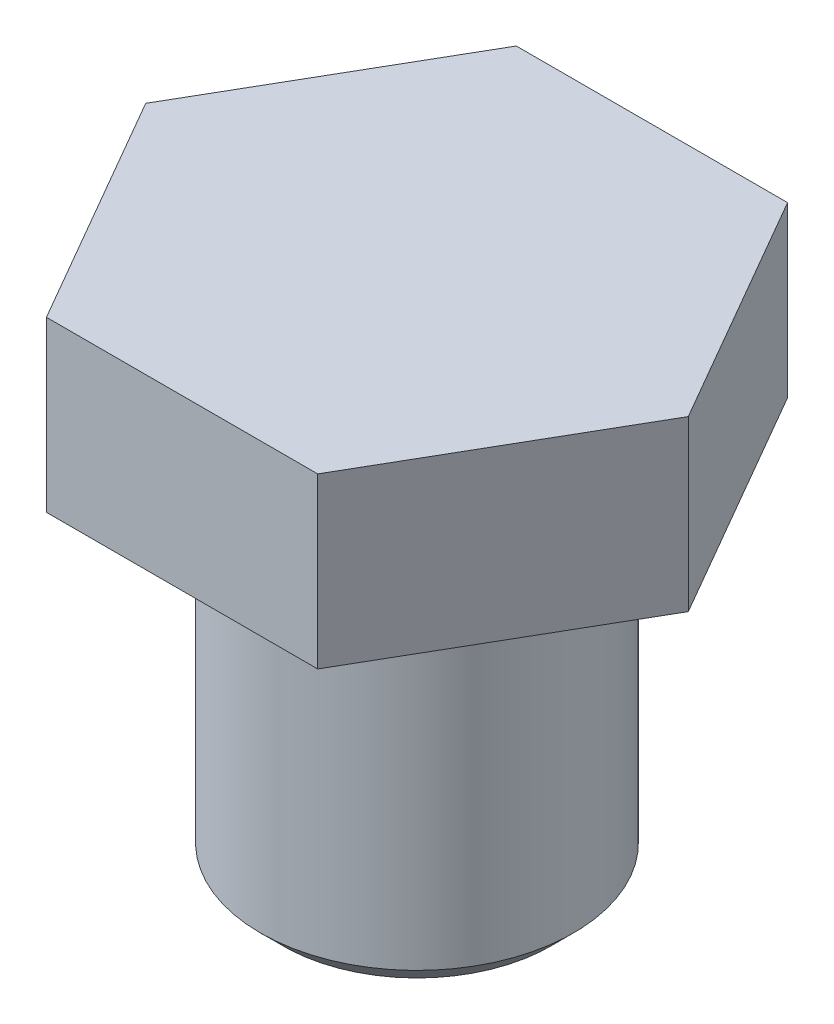
ISO-10303-21;
HEADER;
FILE_DESCRIPTION(('STEP AP214'),'2;1');
FILE_NAME('part.step','',(''),(''),'','','');
FILE_SCHEMA(('AUTOMOTIVE_DESIGN { 1 0 10303 214 1 1 1 1 }'));
ENDSEC;
DATA;
#1=APPLICATION_CONTEXT('core data for automotive mechanical design processes');
#2=APPLICATION_PROTOCOL_DEFINITION('international standard','automotive_design',2000,#1);
#3=PRODUCT_CONTEXT('',#1,'mechanical');
#4=PRODUCT('Part','Part','',(#3));
#5=PRODUCT_RELATED_PRODUCT_CATEGORY('part','',(#4));
#6=PRODUCT_DEFINITION_FORMATION('','',#4);
#7=PRODUCT_DEFINITION_CONTEXT('part definition',#1,'design');
#8=PRODUCT_DEFINITION('design','',#6,#7);
#9=PRODUCT_DEFINITION_SHAPE('','',#8);
#10=(LENGTH_UNIT() NAMED_UNIT(*) SI_UNIT(.MILLI.,.METRE.));
#11=(NAMED_UNIT(*) PLANE_ANGLE_UNIT() SI_UNIT($,.RADIAN.));
#12=(NAMED_UNIT(*) SI_UNIT($,.STERADIAN.) SOLID_ANGLE_UNIT());
#13=UNCERTAINTY_MEASURE_WITH_UNIT(LENGTH_MEASURE(1.E-05),#10,'distance_accuracy_value','');
#14=(GEOMETRIC_REPRESENTATION_CONTEXT(3) GLOBAL_UNCERTAINTY_ASSIGNED_CONTEXT((#13)) GLOBAL_UNIT_ASSIGNED_CONTEXT((#10,
#11,#12)) REPRESENTATION_CONTEXT('',''));
#15=CARTESIAN_POINT('',(0.,0.,0.));
#16=DIRECTION('',(0.,0.,1.));
#17=DIRECTION('',(1.,0.,0.));
#18=AXIS2_PLACEMENT_3D('',#15,#16,#17);
#19=CARTESIAN_POINT('',(-6.06217782649107,7.55,-10.5));
#20=DIRECTION('',(0.866025403784439,0.,0.5));
#21=DIRECTION('',(0.5,0.,-0.866025403784439));
#22=AXIS2_PLACEMENT_3D('',#19,#20,#21);
#23=PLANE('',#22);
#24=DIRECTION('',(-0.5,0.,0.866025403784439));
#25=VECTOR('',#24,1.);
#26=CARTESIAN_POINT('',(-6.06217782649107,0.,-10.5));
#27=LINE('',#26,#25);
#28=CARTESIAN_POINT('',(-6.06217782649107,0.,-10.5));
#29=VERTEX_POINT('',#28);
#30=CARTESIAN_POINT('',(-12.1243556529821,0.,0.));
#31=VERTEX_POINT('',#30);
#32=EDGE_CURVE('E121',#29,#31,#27,.T.);
#33=ORIENTED_EDGE('',*,*,#32,.T.);
#34=DIRECTION('',(0.,-1.,0.));
#35=VECTOR('',#34,1.);
#36=CARTESIAN_POINT('',(-12.1243556529821,7.55,0.));
#37=LINE('',#36,#35);
#38=CARTESIAN_POINT('',(-12.1243556529821,7.55,0.));
#39=VERTEX_POINT('',#38);
#40=EDGE_CURVE('E138',#39,#31,#37,.T.);
#41=ORIENTED_EDGE('',*,*,#40,.F.);
#42=DIRECTION('',(-0.5,0.,0.866025403784439));
#43=VECTOR('',#42,1.);
#44=CARTESIAN_POINT('',(-6.06217782649107,7.55,-10.5));
#45=LINE('',#44,#43);
#46=CARTESIAN_POINT('',(-6.06217782649107,7.55,-10.5));
#47=VERTEX_POINT('',#46);
#48=EDGE_CURVE('E131',#47,#39,#45,.T.);
#49=ORIENTED_EDGE('',*,*,#48,.F.);
#50=DIRECTION('',(0.,-1.,0.));
#51=VECTOR('',#50,1.);
#52=CARTESIAN_POINT('',(-6.06217782649107,7.55,-10.5));
#53=LINE('',#52,#51);
#54=EDGE_CURVE('E117',#47,#29,#53,.T.);
#55=ORIENTED_EDGE('',*,*,#54,.T.);
#56=EDGE_LOOP('',(#33,#41,#49,#55));
#57=FACE_BOUND('',#56,.T.);
#58=ADVANCED_FACE('F34',(#57),#23,.F.);
#59=CARTESIAN_POINT('',(-12.1243556529821,7.55,0.));
#60=DIRECTION('',(0.866025403784439,0.,-0.5));
#61=DIRECTION('',(-0.5,0.,-0.866025403784439));
#62=AXIS2_PLACEMENT_3D('',#59,#60,#61);
#63=PLANE('',#62);
#64=DIRECTION('',(0.5,0.,0.866025403784439));
#65=VECTOR('',#64,1.);
#66=CARTESIAN_POINT('',(-12.1243556529821,0.,0.));
#67=LINE('',#66,#65);
#68=CARTESIAN_POINT('',(-6.06217782649107,0.,10.5));
#69=VERTEX_POINT('',#68);
#70=EDGE_CURVE('E124',#31,#69,#67,.T.);
#71=ORIENTED_EDGE('',*,*,#70,.T.);
#72=DIRECTION('',(0.,-1.,0.));
#73=VECTOR('',#72,1.);
#74=CARTESIAN_POINT('',(-6.06217782649107,7.55,10.5));
#75=LINE('',#74,#73);
#76=CARTESIAN_POINT('',(-6.06217782649107,7.55,10.5));
#77=VERTEX_POINT('',#76);
#78=EDGE_CURVE('E135',#77,#69,#75,.T.);
#79=ORIENTED_EDGE('',*,*,#78,.F.);
#80=DIRECTION('',(0.5,0.,0.866025403784439));
#81=VECTOR('',#80,1.);
#82=CARTESIAN_POINT('',(-12.1243556529821,7.55,0.));
#83=LINE('',#82,#81);
#84=EDGE_CURVE('E90',#39,#77,#83,.T.);
#85=ORIENTED_EDGE('',*,*,#84,.F.);
#86=ORIENTED_EDGE('',*,*,#40,.T.);
#87=EDGE_LOOP('',(#71,#79,#85,#86));
#88=FACE_BOUND('',#87,.T.);
#89=ADVANCED_FACE('F151',(#88),#63,.F.);
#90=CARTESIAN_POINT('',(-6.06217782649107,7.55,10.5));
#91=DIRECTION('',(0.,0.,-1.));
#92=DIRECTION('',(-1.,0.,0.));
#93=AXIS2_PLACEMENT_3D('',#90,#91,#92);
#94=PLANE('',#93);
#95=DIRECTION('',(1.,0.,0.));
#96=VECTOR('',#95,1.);
#97=CARTESIAN_POINT('',(-6.06217782649107,0.,10.5));
#98=LINE('',#97,#96);
#99=CARTESIAN_POINT('',(6.06217782649107,0.,10.5));
#100=VERTEX_POINT('',#99);
#101=EDGE_CURVE('E126',#69,#100,#98,.T.);
#102=ORIENTED_EDGE('',*,*,#101,.T.);
#103=DIRECTION('',(0.,-1.,0.));
#104=VECTOR('',#103,1.);
#105=CARTESIAN_POINT('',(6.06217782649107,7.55,10.5));
#106=LINE('',#105,#104);
#107=CARTESIAN_POINT('',(6.06217782649107,7.55,10.5));
#108=VERTEX_POINT('',#107);
#109=EDGE_CURVE('E112',#108,#100,#106,.T.);
#110=ORIENTED_EDGE('',*,*,#109,.F.);
#111=DIRECTION('',(1.,0.,0.));
#112=VECTOR('',#111,1.);
#113=CARTESIAN_POINT('',(-6.06217782649107,7.55,10.5));
#114=LINE('',#113,#112);
#115=EDGE_CURVE('E103',#77,#108,#114,.T.);
#116=ORIENTED_EDGE('',*,*,#115,.F.);
#117=ORIENTED_EDGE('',*,*,#78,.T.);
#118=EDGE_LOOP('',(#102,#110,#116,#117));
#119=FACE_BOUND('',#118,.T.);
#120=ADVANCED_FACE('F154',(#119),#94,.F.);
#121=CARTESIAN_POINT('',(6.06217782649107,7.55,10.5));
#122=DIRECTION('',(-0.866025403784439,0.,-0.5));
#123=DIRECTION('',(-0.5,0.,0.866025403784439));
#124=AXIS2_PLACEMENT_3D('',#121,#122,#123);
#125=PLANE('',#124);
#126=DIRECTION('',(0.5,0.,-0.866025403784439));
#127=VECTOR('',#126,1.);
#128=CARTESIAN_POINT('',(6.06217782649107,0.,10.5));
#129=LINE('',#128,#127);
#130=CARTESIAN_POINT('',(12.1243556529821,0.,0.));
#131=VERTEX_POINT('',#130);
#132=EDGE_CURVE('E111',#100,#131,#129,.T.);
#133=ORIENTED_EDGE('',*,*,#132,.T.);
#134=DIRECTION('',(0.,-1.,0.));
#135=VECTOR('',#134,1.);
#136=CARTESIAN_POINT('',(12.1243556529821,7.55,0.));
#137=LINE('',#136,#135);
#138=CARTESIAN_POINT('',(12.1243556529821,7.55,0.));
#139=VERTEX_POINT('',#138);
#140=EDGE_CURVE('E108',#139,#131,#137,.T.);
#141=ORIENTED_EDGE('',*,*,#140,.F.);
#142=DIRECTION('',(0.5,0.,-0.866025403784439));
#143=VECTOR('',#142,1.);
#144=CARTESIAN_POINT('',(6.06217782649107,7.55,10.5));
#145=LINE('',#144,#143);
#146=EDGE_CURVE('E97',#108,#139,#145,.T.);
#147=ORIENTED_EDGE('',*,*,#146,.F.);
#148=ORIENTED_EDGE('',*,*,#109,.T.);
#149=EDGE_LOOP('',(#133,#141,#147,#148));
#150=FACE_BOUND('',#149,.T.);
#151=ADVANCED_FACE('F109',(#150),#125,.F.);
#152=CARTESIAN_POINT('',(12.1243556529821,7.55,0.));
#153=DIRECTION('',(-0.866025403784439,0.,0.5));
#154=DIRECTION('',(0.5,0.,0.866025403784439));
#155=AXIS2_PLACEMENT_3D('',#152,#153,#154);
#156=PLANE('',#155);
#157=DIRECTION('',(-0.5,0.,-0.866025403784439));
#158=VECTOR('',#157,1.);
#159=CARTESIAN_POINT('',(12.1243556529821,0.,0.));
#160=LINE('',#159,#158);
#161=CARTESIAN_POINT('',(6.06217782649107,0.,-10.5));
#162=VERTEX_POINT('',#161);
#163=EDGE_CURVE('E75',#131,#162,#160,.T.);
#164=ORIENTED_EDGE('',*,*,#163,.T.);
#165=DIRECTION('',(0.,-1.,0.));
#166=VECTOR('',#165,1.);
#167=CARTESIAN_POINT('',(6.06217782649107,7.55,-10.5));
#168=LINE('',#167,#166);
#169=CARTESIAN_POINT('',(6.06217782649107,7.55,-10.5));
#170=VERTEX_POINT('',#169);
#171=EDGE_CURVE('E113',#170,#162,#168,.T.);
#172=ORIENTED_EDGE('',*,*,#171,.F.);
#173=DIRECTION('',(-0.5,0.,-0.866025403784439));
#174=VECTOR('',#173,1.);
#175=CARTESIAN_POINT('',(12.1243556529821,7.55,0.));
#176=LINE('',#175,#174);
#177=EDGE_CURVE('E101',#139,#170,#176,.T.);
#178=ORIENTED_EDGE('',*,*,#177,.F.);
#179=ORIENTED_EDGE('',*,*,#140,.T.);
#180=EDGE_LOOP('',(#164,#172,#178,#179));
#181=FACE_BOUND('',#180,.T.);
#182=ADVANCED_FACE('F115',(#181),#156,.F.);
#183=CARTESIAN_POINT('',(6.06217782649107,7.55,-10.5));
#184=DIRECTION('',(0.,0.,1.));
#185=DIRECTION('',(1.,0.,0.));
#186=AXIS2_PLACEMENT_3D('',#183,#184,#185);
#187=PLANE('',#186);
#188=DIRECTION('',(-1.,0.,0.));
#189=VECTOR('',#188,1.);
#190=CARTESIAN_POINT('',(6.06217782649107,0.,-10.5));
#191=LINE('',#190,#189);
#192=EDGE_CURVE('E81',#162,#29,#191,.T.);
#193=ORIENTED_EDGE('',*,*,#192,.T.);
#194=ORIENTED_EDGE('',*,*,#54,.F.);
#195=DIRECTION('',(-1.,0.,0.));
#196=VECTOR('',#195,1.);
#197=CARTESIAN_POINT('',(6.06217782649107,7.55,-10.5));
#198=LINE('',#197,#196);
#199=EDGE_CURVE('E52',#170,#47,#198,.T.);
#200=ORIENTED_EDGE('',*,*,#199,.F.);
#201=ORIENTED_EDGE('',*,*,#171,.T.);
#202=EDGE_LOOP('',(#193,#194,#200,#201));
#203=FACE_BOUND('',#202,.T.);
#204=ADVANCED_FACE('F159',(#203),#187,.F.);
#205=CARTESIAN_POINT('',(0.,7.55,0.));
#206=DIRECTION('',(0.,1.,0.));
#207=DIRECTION('',(0.,0.,1.));
#208=AXIS2_PLACEMENT_3D('',#205,#206,#207);
#209=PLANE('',#208);
#210=ORIENTED_EDGE('',*,*,#48,.T.);
#211=ORIENTED_EDGE('',*,*,#84,.T.);
#212=ORIENTED_EDGE('',*,*,#115,.T.);
#213=ORIENTED_EDGE('',*,*,#146,.T.);
#214=ORIENTED_EDGE('',*,*,#177,.T.);
#215=ORIENTED_EDGE('',*,*,#199,.T.);
#216=EDGE_LOOP('',(#210,#211,#212,#213,#214,#215));
#217=FACE_BOUND('',#216,.T.);
#218=ADVANCED_FACE('F99',(#217),#209,.T.);
#219=CARTESIAN_POINT('',(0.,0.,0.));
#220=DIRECTION('',(0.,1.,0.));
#221=DIRECTION('',(0.,0.,1.));
#222=AXIS2_PLACEMENT_3D('',#219,#220,#221);
#223=PLANE('',#222);
#224=CARTESIAN_POINT('',(0.,0.,0.));
#225=DIRECTION('',(0.,-1.,0.));
#226=DIRECTION('',(0.,0.,-1.));
#227=AXIS2_PLACEMENT_3D('',#224,#225,#226);
#228=CIRCLE('',#227,7.);
#229=CARTESIAN_POINT('',(0.,0.,-7.));
#230=VERTEX_POINT('',#229);
#231=EDGE_CURVE('E139',#230,#230,#228,.T.);
#232=ORIENTED_EDGE('',*,*,#231,.F.);
#233=EDGE_LOOP('',(#232));
#234=FACE_BOUND('',#233,.T.);
#235=ORIENTED_EDGE('',*,*,#32,.F.);
#236=ORIENTED_EDGE('',*,*,#192,.F.);
#237=ORIENTED_EDGE('',*,*,#163,.F.);
#238=ORIENTED_EDGE('',*,*,#132,.F.);
#239=ORIENTED_EDGE('',*,*,#101,.F.);
#240=ORIENTED_EDGE('',*,*,#70,.F.);
#241=EDGE_LOOP('',(#235,#236,#237,#238,#239,#240));
#242=FACE_BOUND('',#241,.T.);
#243=ADVANCED_FACE('F157',(#234,#242),#223,.F.);
#244=CARTESIAN_POINT('',(0.,-16.,0.));
#245=DIRECTION('',(0.,1.,0.));
#246=DIRECTION('',(0.,0.,1.));
#247=AXIS2_PLACEMENT_3D('',#244,#245,#246);
#248=CYLINDRICAL_SURFACE('',#247,7.);
#249=CARTESIAN_POINT('',(0.,-15.,0.));
#250=DIRECTION('',(0.,-1.,0.));
#251=DIRECTION('',(0.,0.,-1.));
#252=AXIS2_PLACEMENT_3D('',#249,#250,#251);
#253=CIRCLE('',#252,7.);
#254=CARTESIAN_POINT('',(0.,-15.,-7.));
#255=VERTEX_POINT('',#254);
#256=EDGE_CURVE('E11',#255,#255,#253,.F.);
#257=ORIENTED_EDGE('',*,*,#256,.T.);
#258=EDGE_LOOP('',(#257));
#259=FACE_BOUND('',#258,.T.);
#260=ORIENTED_EDGE('',*,*,#231,.T.);
#261=EDGE_LOOP('',(#260));
#262=FACE_BOUND('',#261,.T.);
#263=ADVANCED_FACE('F205',(#259,#262),#248,.T.);
#264=CARTESIAN_POINT('',(0.,-16.,0.));
#265=DIRECTION('',(0.,-1.,0.));
#266=DIRECTION('',(0.,0.,-1.));
#267=AXIS2_PLACEMENT_3D('',#264,#265,#266);
#268=PLANE('',#267);
#269=CARTESIAN_POINT('',(0.,-16.,0.));
#270=DIRECTION('',(0.,-1.,0.));
#271=DIRECTION('',(0.,0.,-1.));
#272=AXIS2_PLACEMENT_3D('',#269,#270,#271);
#273=CIRCLE('',#272,6.);
#274=CARTESIAN_POINT('',(0.,-16.,-6.));
#275=VERTEX_POINT('',#274);
#276=EDGE_CURVE('E44',#275,#275,#273,.T.);
#277=ORIENTED_EDGE('',*,*,#276,.T.);
#278=EDGE_LOOP('',(#277));
#279=FACE_BOUND('',#278,.T.);
#280=ADVANCED_FACE('F214',(#279),#268,.T.);
#281=CARTESIAN_POINT('',(0.,-16.,0.));
#282=DIRECTION('',(0.,1.,0.));
#283=DIRECTION('',(0.,0.,1.));
#284=AXIS2_PLACEMENT_3D('',#281,#282,#283);
#285=CONICAL_SURFACE('',#284,6.,0.785398163397449);
#286=ORIENTED_EDGE('',*,*,#256,.F.);
#287=EDGE_LOOP('',(#286));
#288=FACE_BOUND('',#287,.T.);
#289=ORIENTED_EDGE('',*,*,#276,.F.);
#290=EDGE_LOOP('',(#289));
#291=FACE_BOUND('',#290,.T.);
#292=ADVANCED_FACE('F37',(#288,#291),#285,.T.);
#293=CLOSED_SHELL('',(#58,#89,#120,#151,#182,#204,#218,#243,#263,#280,#292));
#294=MANIFOLD_SOLID_BREP('B2',#293);
#295=ADVANCED_BREP_SHAPE_REPRESENTATION('',(#18,#294),#14);
#296=SHAPE_DEFINITION_REPRESENTATION(#9,#295);
ENDSEC;
END-ISO-10303-21;
